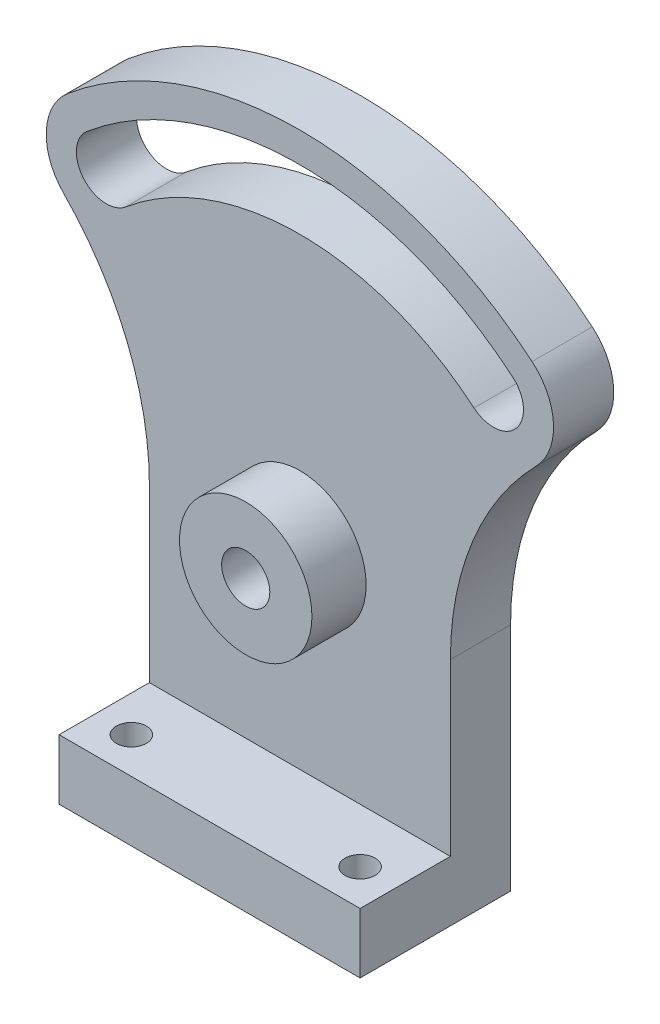
ISO-10303-21;
HEADER;
FILE_DESCRIPTION(('STEP AP214'),'2;1');
FILE_NAME('part.step','',(''),(''),'','','');
FILE_SCHEMA(('AUTOMOTIVE_DESIGN { 1 0 10303 214 1 1 1 1 }'));
ENDSEC;
DATA;
#1=APPLICATION_CONTEXT('core data for automotive mechanical design processes');
#2=APPLICATION_PROTOCOL_DEFINITION('international standard','automotive_design',2000,#1);
#3=PRODUCT_CONTEXT('',#1,'mechanical');
#4=PRODUCT('Part','Part','',(#3));
#5=PRODUCT_RELATED_PRODUCT_CATEGORY('part','',(#4));
#6=PRODUCT_DEFINITION_FORMATION('','',#4);
#7=PRODUCT_DEFINITION_CONTEXT('part definition',#1,'design');
#8=PRODUCT_DEFINITION('design','',#6,#7);
#9=PRODUCT_DEFINITION_SHAPE('','',#8);
#10=(LENGTH_UNIT() NAMED_UNIT(*) SI_UNIT(.MILLI.,.METRE.));
#11=(NAMED_UNIT(*) PLANE_ANGLE_UNIT() SI_UNIT($,.RADIAN.));
#12=(NAMED_UNIT(*) SI_UNIT($,.STERADIAN.) SOLID_ANGLE_UNIT());
#13=UNCERTAINTY_MEASURE_WITH_UNIT(LENGTH_MEASURE(1.E-05),#10,'distance_accuracy_value','');
#14=(GEOMETRIC_REPRESENTATION_CONTEXT(3) GLOBAL_UNCERTAINTY_ASSIGNED_CONTEXT((#13)) GLOBAL_UNIT_ASSIGNED_CONTEXT((#10,
#11,#12)) REPRESENTATION_CONTEXT('',''));
#15=CARTESIAN_POINT('',(0.,0.,0.));
#16=DIRECTION('',(0.,0.,1.));
#17=DIRECTION('',(1.,0.,0.));
#18=AXIS2_PLACEMENT_3D('',#15,#16,#17);
#19=CARTESIAN_POINT('',(25.,0.,25.));
#20=DIRECTION('',(1.,0.,0.));
#21=DIRECTION('',(0.,1.,0.));
#22=AXIS2_PLACEMENT_3D('',#19,#20,#21);
#23=PLANE('',#22);
#24=DIRECTION('',(0.,-1.,0.));
#25=VECTOR('',#24,1.);
#26=CARTESIAN_POINT('',(25.,0.,0.));
#27=LINE('',#26,#25);
#28=CARTESIAN_POINT('',(25.,38.3145180661476,0.));
#29=VERTEX_POINT('',#28);
#30=CARTESIAN_POINT('',(25.,0.,0.));
#31=VERTEX_POINT('',#30);
#32=EDGE_CURVE('E232',#29,#31,#27,.T.);
#33=ORIENTED_EDGE('',*,*,#32,.F.);
#34=DIRECTION('',(0.,0.,-1.));
#35=VECTOR('',#34,1.);
#36=CARTESIAN_POINT('',(25.,38.3145180661476,10.));
#37=LINE('',#36,#35);
#38=CARTESIAN_POINT('',(25.,38.3145180661476,10.));
#39=VERTEX_POINT('',#38);
#40=EDGE_CURVE('E259',#39,#29,#37,.T.);
#41=ORIENTED_EDGE('',*,*,#40,.F.);
#42=DIRECTION('',(0.,-1.,0.));
#43=VECTOR('',#42,1.);
#44=CARTESIAN_POINT('',(25.,0.,10.));
#45=LINE('',#44,#43);
#46=CARTESIAN_POINT('',(25.,10.,10.));
#47=VERTEX_POINT('',#46);
#48=EDGE_CURVE('E199',#39,#47,#45,.T.);
#49=ORIENTED_EDGE('',*,*,#48,.T.);
#50=DIRECTION('',(0.,0.,-1.));
#51=VECTOR('',#50,1.);
#52=CARTESIAN_POINT('',(25.,10.,25.));
#53=LINE('',#52,#51);
#54=CARTESIAN_POINT('',(25.,10.,25.));
#55=VERTEX_POINT('',#54);
#56=EDGE_CURVE('E82',#55,#47,#53,.T.);
#57=ORIENTED_EDGE('',*,*,#56,.F.);
#58=DIRECTION('',(0.,-1.,0.));
#59=VECTOR('',#58,1.);
#60=CARTESIAN_POINT('',(25.,0.,25.));
#61=LINE('',#60,#59);
#62=CARTESIAN_POINT('',(25.,0.,25.));
#63=VERTEX_POINT('',#62);
#64=EDGE_CURVE('E219',#55,#63,#61,.T.);
#65=ORIENTED_EDGE('',*,*,#64,.T.);
#66=DIRECTION('',(0.,0.,-1.));
#67=VECTOR('',#66,1.);
#68=CARTESIAN_POINT('',(25.,0.,25.));
#69=LINE('',#68,#67);
#70=EDGE_CURVE('E113',#63,#31,#69,.T.);
#71=ORIENTED_EDGE('',*,*,#70,.T.);
#72=EDGE_LOOP('',(#33,#41,#49,#57,#65,#71));
#73=FACE_BOUND('',#72,.T.);
#74=ADVANCED_FACE('F74',(#73),#23,.T.);
#75=CARTESIAN_POINT('',(0.,10.,25.));
#76=DIRECTION('',(0.,1.,0.));
#77=DIRECTION('',(-1.,0.,0.));
#78=AXIS2_PLACEMENT_3D('',#75,#76,#77);
#79=PLANE('',#78);
#80=CARTESIAN_POINT('',(-19.,10.,19.));
#81=DIRECTION('',(0.,1.,0.));
#82=DIRECTION('',(0.,0.,1.));
#83=AXIS2_PLACEMENT_3D('',#80,#81,#82);
#84=CIRCLE('',#83,2.49999999999999);
#85=CARTESIAN_POINT('',(-19.,10.,21.5));
#86=VERTEX_POINT('',#85);
#87=EDGE_CURVE('E377',#86,#86,#84,.T.);
#88=ORIENTED_EDGE('',*,*,#87,.F.);
#89=EDGE_LOOP('',(#88));
#90=FACE_BOUND('',#89,.T.);
#91=CARTESIAN_POINT('',(19.,10.,19.));
#92=DIRECTION('',(0.,1.,0.));
#93=DIRECTION('',(0.,0.,1.));
#94=AXIS2_PLACEMENT_3D('',#91,#92,#93);
#95=CIRCLE('',#94,2.49999999999999);
#96=CARTESIAN_POINT('',(19.,10.,21.5));
#97=VERTEX_POINT('',#96);
#98=EDGE_CURVE('E369',#97,#97,#95,.T.);
#99=ORIENTED_EDGE('',*,*,#98,.F.);
#100=EDGE_LOOP('',(#99));
#101=FACE_BOUND('',#100,.T.);
#102=DIRECTION('',(1.,0.,0.));
#103=VECTOR('',#102,1.);
#104=CARTESIAN_POINT('',(0.,10.,10.));
#105=LINE('',#104,#103);
#106=CARTESIAN_POINT('',(-25.,10.,10.));
#107=VERTEX_POINT('',#106);
#108=EDGE_CURVE('E89',#107,#47,#105,.T.);
#109=ORIENTED_EDGE('',*,*,#108,.F.);
#110=DIRECTION('',(0.,0.,-1.));
#111=VECTOR('',#110,1.);
#112=CARTESIAN_POINT('',(-25.,10.,25.));
#113=LINE('',#112,#111);
#114=CARTESIAN_POINT('',(-25.,10.,25.));
#115=VERTEX_POINT('',#114);
#116=EDGE_CURVE('E248',#115,#107,#113,.T.);
#117=ORIENTED_EDGE('',*,*,#116,.F.);
#118=DIRECTION('',(1.,0.,0.));
#119=VECTOR('',#118,1.);
#120=CARTESIAN_POINT('',(0.,10.,25.));
#121=LINE('',#120,#119);
#122=EDGE_CURVE('E222',#115,#55,#121,.T.);
#123=ORIENTED_EDGE('',*,*,#122,.T.);
#124=ORIENTED_EDGE('',*,*,#56,.T.);
#125=EDGE_LOOP('',(#109,#117,#123,#124));
#126=FACE_BOUND('',#125,.T.);
#127=ADVANCED_FACE('F251',(#90,#101,#126),#79,.T.);
#128=CARTESIAN_POINT('',(-25.,0.,25.));
#129=DIRECTION('',(1.,0.,0.));
#130=DIRECTION('',(0.,0.,-1.));
#131=AXIS2_PLACEMENT_3D('',#128,#129,#130);
#132=PLANE('',#131);
#133=DIRECTION('',(0.,-1.,0.));
#134=VECTOR('',#133,1.);
#135=CARTESIAN_POINT('',(-25.,0.,0.));
#136=LINE('',#135,#134);
#137=CARTESIAN_POINT('',(-25.,38.3145180661475,0.));
#138=VERTEX_POINT('',#137);
#139=CARTESIAN_POINT('',(-25.,0.,0.));
#140=VERTEX_POINT('',#139);
#141=EDGE_CURVE('E236',#138,#140,#136,.T.);
#142=ORIENTED_EDGE('',*,*,#141,.T.);
#143=DIRECTION('',(0.,0.,-1.));
#144=VECTOR('',#143,1.);
#145=CARTESIAN_POINT('',(-25.,0.,25.));
#146=LINE('',#145,#144);
#147=CARTESIAN_POINT('',(-25.,0.,25.));
#148=VERTEX_POINT('',#147);
#149=EDGE_CURVE('E244',#148,#140,#146,.T.);
#150=ORIENTED_EDGE('',*,*,#149,.F.);
#151=DIRECTION('',(0.,-1.,0.));
#152=VECTOR('',#151,1.);
#153=CARTESIAN_POINT('',(-25.,0.,25.));
#154=LINE('',#153,#152);
#155=EDGE_CURVE('E227',#115,#148,#154,.T.);
#156=ORIENTED_EDGE('',*,*,#155,.F.);
#157=ORIENTED_EDGE('',*,*,#116,.T.);
#158=DIRECTION('',(0.,-1.,0.));
#159=VECTOR('',#158,1.);
#160=CARTESIAN_POINT('',(-25.,0.,10.));
#161=LINE('',#160,#159);
#162=CARTESIAN_POINT('',(-25.,38.3145180661475,10.));
#163=VERTEX_POINT('',#162);
#164=EDGE_CURVE('E256',#163,#107,#161,.T.);
#165=ORIENTED_EDGE('',*,*,#164,.F.);
#166=DIRECTION('',(0.,0.,-1.));
#167=VECTOR('',#166,1.);
#168=CARTESIAN_POINT('',(-25.,38.3145180661475,10.));
#169=LINE('',#168,#167);
#170=EDGE_CURVE('E324',#163,#138,#169,.T.);
#171=ORIENTED_EDGE('',*,*,#170,.T.);
#172=EDGE_LOOP('',(#142,#150,#156,#157,#165,#171));
#173=FACE_BOUND('',#172,.T.);
#174=ADVANCED_FACE('F386',(#173),#132,.F.);
#175=CARTESIAN_POINT('',(0.,0.,25.));
#176=DIRECTION('',(0.,1.,0.));
#177=DIRECTION('',(-1.,0.,0.));
#178=AXIS2_PLACEMENT_3D('',#175,#176,#177);
#179=PLANE('',#178);
#180=CARTESIAN_POINT('',(-19.,0.,19.));
#181=DIRECTION('',(0.,1.,0.));
#182=DIRECTION('',(-1.,0.,0.));
#183=AXIS2_PLACEMENT_3D('',#180,#181,#182);
#184=CIRCLE('',#183,2.49999999999999);
#185=CARTESIAN_POINT('',(-21.5,0.,19.));
#186=VERTEX_POINT('',#185);
#187=EDGE_CURVE('E373',#186,#186,#184,.T.);
#188=ORIENTED_EDGE('',*,*,#187,.T.);
#189=EDGE_LOOP('',(#188));
#190=FACE_BOUND('',#189,.T.);
#191=CARTESIAN_POINT('',(19.,0.,19.));
#192=DIRECTION('',(0.,1.,0.));
#193=DIRECTION('',(-1.,0.,0.));
#194=AXIS2_PLACEMENT_3D('',#191,#192,#193);
#195=CIRCLE('',#194,2.49999999999999);
#196=CARTESIAN_POINT('',(16.5,0.,19.));
#197=VERTEX_POINT('',#196);
#198=EDGE_CURVE('E365',#197,#197,#195,.T.);
#199=ORIENTED_EDGE('',*,*,#198,.T.);
#200=EDGE_LOOP('',(#199));
#201=FACE_BOUND('',#200,.T.);
#202=DIRECTION('',(1.,0.,0.));
#203=VECTOR('',#202,1.);
#204=CARTESIAN_POINT('',(0.,0.,0.));
#205=LINE('',#204,#203);
#206=EDGE_CURVE('E223',#140,#31,#205,.T.);
#207=ORIENTED_EDGE('',*,*,#206,.T.);
#208=ORIENTED_EDGE('',*,*,#70,.F.);
#209=DIRECTION('',(1.,0.,0.));
#210=VECTOR('',#209,1.);
#211=CARTESIAN_POINT('',(0.,0.,25.));
#212=LINE('',#211,#210);
#213=EDGE_CURVE('E98',#148,#63,#212,.T.);
#214=ORIENTED_EDGE('',*,*,#213,.F.);
#215=ORIENTED_EDGE('',*,*,#149,.T.);
#216=EDGE_LOOP('',(#207,#208,#214,#215));
#217=FACE_BOUND('',#216,.T.);
#218=ADVANCED_FACE('F420',(#190,#201,#217),#179,.F.);
#219=CARTESIAN_POINT('',(0.,0.,25.));
#220=DIRECTION('',(0.,0.,1.));
#221=DIRECTION('',(1.,0.,0.));
#222=AXIS2_PLACEMENT_3D('',#219,#220,#221);
#223=PLANE('',#222);
#224=ORIENTED_EDGE('',*,*,#64,.F.);
#225=ORIENTED_EDGE('',*,*,#122,.F.);
#226=ORIENTED_EDGE('',*,*,#155,.T.);
#227=ORIENTED_EDGE('',*,*,#213,.T.);
#228=EDGE_LOOP('',(#224,#225,#226,#227));
#229=FACE_BOUND('',#228,.T.);
#230=ADVANCED_FACE('F415',(#229),#223,.T.);
#231=CARTESIAN_POINT('',(0.,0.,0.));
#232=DIRECTION('',(0.,0.,1.));
#233=DIRECTION('',(1.,0.,0.));
#234=AXIS2_PLACEMENT_3D('',#231,#232,#233);
#235=PLANE('',#234);
#236=ORIENTED_EDGE('',*,*,#32,.T.);
#237=ORIENTED_EDGE('',*,*,#206,.F.);
#238=ORIENTED_EDGE('',*,*,#141,.F.);
#239=CARTESIAN_POINT('',(-75.,38.3145180661475,0.));
#240=DIRECTION('',(0.,0.,1.));
#241=DIRECTION('',(1.,0.,0.));
#242=AXIS2_PLACEMENT_3D('',#239,#240,#241);
#243=CIRCLE('',#242,50.);
#244=CARTESIAN_POINT('',(-39.2828170702725,73.3042714743153,0.));
#245=VERTEX_POINT('',#244);
#246=EDGE_CURVE('E296',#138,#245,#243,.T.);
#247=ORIENTED_EDGE('',*,*,#246,.T.);
#248=CARTESIAN_POINT('',(-32.139380484327,80.3022221559488,0.));
#249=DIRECTION('',(0.,0.,1.));
#250=DIRECTION('',(1.,0.,0.));
#251=AXIS2_PLACEMENT_3D('',#248,#249,#250);
#252=CIRCLE('',#251,10.);
#253=CARTESIAN_POINT('',(-38.5672565811925,87.9626665871386,0.));
#254=VERTEX_POINT('',#253);
#255=EDGE_CURVE('E292',#254,#245,#252,.T.);
#256=ORIENTED_EDGE('',*,*,#255,.F.);
#257=CARTESIAN_POINT('',(0.,42.,0.));
#258=DIRECTION('',(0.,0.,1.));
#259=DIRECTION('',(1.,0.,0.));
#260=AXIS2_PLACEMENT_3D('',#257,#258,#259);
#261=CIRCLE('',#260,60.);
#262=CARTESIAN_POINT('',(38.5672565811924,87.9626665871386,0.));
#263=VERTEX_POINT('',#262);
#264=EDGE_CURVE('E289',#263,#254,#261,.T.);
#265=ORIENTED_EDGE('',*,*,#264,.F.);
#266=CARTESIAN_POINT('',(32.139380484327,80.3022221559489,0.));
#267=DIRECTION('',(0.,0.,1.));
#268=DIRECTION('',(1.,0.,0.));
#269=AXIS2_PLACEMENT_3D('',#266,#267,#268);
#270=CIRCLE('',#269,10.);
#271=CARTESIAN_POINT('',(39.2828170702725,73.3042714743153,0.));
#272=VERTEX_POINT('',#271);
#273=EDGE_CURVE('E285',#272,#263,#270,.T.);
#274=ORIENTED_EDGE('',*,*,#273,.F.);
#275=CARTESIAN_POINT('',(75.,38.3145180661476,0.));
#276=DIRECTION('',(0.,0.,1.));
#277=DIRECTION('',(1.,0.,0.));
#278=AXIS2_PLACEMENT_3D('',#275,#276,#277);
#279=CIRCLE('',#278,50.);
#280=EDGE_CURVE('E207',#29,#272,#279,.F.);
#281=ORIENTED_EDGE('',*,*,#280,.F.);
#282=EDGE_LOOP('',(#236,#237,#238,#247,#256,#265,#274,#281));
#283=FACE_BOUND('',#282,.T.);
#284=CARTESIAN_POINT('',(-32.139380484327,80.3022221559488,0.));
#285=DIRECTION('',(0.,0.,1.));
#286=DIRECTION('',(1.,0.,0.));
#287=AXIS2_PLACEMENT_3D('',#284,#285,#286);
#288=CIRCLE('',#287,4.99999999999998);
#289=CARTESIAN_POINT('',(-35.3533185327597,84.1324443715437,0.));
#290=VERTEX_POINT('',#289);
#291=CARTESIAN_POINT('',(-28.9254424358943,76.471999940354,0.));
#292=VERTEX_POINT('',#291);
#293=EDGE_CURVE('E300',#290,#292,#288,.T.);
#294=ORIENTED_EDGE('',*,*,#293,.T.);
#295=CARTESIAN_POINT('',(0.,42.,0.));
#296=DIRECTION('',(0.,0.,1.));
#297=DIRECTION('',(1.,0.,0.));
#298=AXIS2_PLACEMENT_3D('',#295,#296,#297);
#299=CIRCLE('',#298,45.);
#300=CARTESIAN_POINT('',(28.9254424358943,76.471999940354,0.));
#301=VERTEX_POINT('',#300);
#302=EDGE_CURVE('E203',#301,#292,#299,.T.);
#303=ORIENTED_EDGE('',*,*,#302,.F.);
#304=CARTESIAN_POINT('',(32.139380484327,80.3022221559489,0.));
#305=DIRECTION('',(0.,0.,1.));
#306=DIRECTION('',(1.,0.,0.));
#307=AXIS2_PLACEMENT_3D('',#304,#305,#306);
#308=CIRCLE('',#307,4.99999999999998);
#309=CARTESIAN_POINT('',(35.3533185327597,84.1324443715437,0.));
#310=VERTEX_POINT('',#309);
#311=EDGE_CURVE('E308',#301,#310,#308,.T.);
#312=ORIENTED_EDGE('',*,*,#311,.T.);
#313=CARTESIAN_POINT('',(0.,42.,0.));
#314=DIRECTION('',(0.,0.,1.));
#315=DIRECTION('',(1.,0.,0.));
#316=AXIS2_PLACEMENT_3D('',#313,#314,#315);
#317=CIRCLE('',#316,55.);
#318=EDGE_CURVE('E304',#310,#290,#317,.T.);
#319=ORIENTED_EDGE('',*,*,#318,.T.);
#320=EDGE_LOOP('',(#294,#303,#312,#319));
#321=FACE_BOUND('',#320,.T.);
#322=ADVANCED_FACE('F342',(#283,#321),#235,.F.);
#323=CARTESIAN_POINT('',(-32.139380484327,80.3022221559488,10.));
#324=DIRECTION('',(0.,0.,-1.));
#325=DIRECTION('',(-1.,0.,0.));
#326=AXIS2_PLACEMENT_3D('',#323,#324,#325);
#327=CYLINDRICAL_SURFACE('',#326,4.99999999999998);
#328=ORIENTED_EDGE('',*,*,#293,.F.);
#329=DIRECTION('',(0.,0.,-1.));
#330=VECTOR('',#329,1.);
#331=CARTESIAN_POINT('',(-35.3533185327597,84.1324443715437,10.));
#332=LINE('',#331,#330);
#333=CARTESIAN_POINT('',(-35.3533185327597,84.1324443715437,10.));
#334=VERTEX_POINT('',#333);
#335=EDGE_CURVE('E237',#334,#290,#332,.T.);
#336=ORIENTED_EDGE('',*,*,#335,.F.);
#337=CARTESIAN_POINT('',(-32.139380484327,80.3022221559488,10.));
#338=DIRECTION('',(0.,0.,1.));
#339=DIRECTION('',(1.,0.,0.));
#340=AXIS2_PLACEMENT_3D('',#337,#338,#339);
#341=CIRCLE('',#340,4.99999999999998);
#342=CARTESIAN_POINT('',(-28.9254424358943,76.471999940354,10.));
#343=VERTEX_POINT('',#342);
#344=EDGE_CURVE('E265',#334,#343,#341,.T.);
#345=ORIENTED_EDGE('',*,*,#344,.T.);
#346=DIRECTION('',(0.,0.,-1.));
#347=VECTOR('',#346,1.);
#348=CARTESIAN_POINT('',(-28.9254424358943,76.471999940354,10.));
#349=LINE('',#348,#347);
#350=EDGE_CURVE('E209',#343,#292,#349,.T.);
#351=ORIENTED_EDGE('',*,*,#350,.T.);
#352=EDGE_LOOP('',(#328,#336,#345,#351));
#353=FACE_BOUND('',#352,.T.);
#354=ADVANCED_FACE('F427',(#353),#327,.F.);
#355=CARTESIAN_POINT('',(0.,42.,10.));
#356=DIRECTION('',(0.,0.,-1.));
#357=DIRECTION('',(-1.,0.,0.));
#358=AXIS2_PLACEMENT_3D('',#355,#356,#357);
#359=CYLINDRICAL_SURFACE('',#358,55.);
#360=ORIENTED_EDGE('',*,*,#318,.F.);
#361=DIRECTION('',(0.,0.,-1.));
#362=VECTOR('',#361,1.);
#363=CARTESIAN_POINT('',(35.3533185327597,84.1324443715437,10.));
#364=LINE('',#363,#362);
#365=CARTESIAN_POINT('',(35.3533185327597,84.1324443715437,10.));
#366=VERTEX_POINT('',#365);
#367=EDGE_CURVE('E317',#366,#310,#364,.T.);
#368=ORIENTED_EDGE('',*,*,#367,.F.);
#369=CARTESIAN_POINT('',(0.,42.,10.));
#370=DIRECTION('',(0.,0.,1.));
#371=DIRECTION('',(1.,0.,0.));
#372=AXIS2_PLACEMENT_3D('',#369,#370,#371);
#373=CIRCLE('',#372,55.);
#374=EDGE_CURVE('E272',#366,#334,#373,.T.);
#375=ORIENTED_EDGE('',*,*,#374,.T.);
#376=ORIENTED_EDGE('',*,*,#335,.T.);
#377=EDGE_LOOP('',(#360,#368,#375,#376));
#378=FACE_BOUND('',#377,.T.);
#379=ADVANCED_FACE('F431',(#378),#359,.F.);
#380=CARTESIAN_POINT('',(32.139380484327,80.3022221559489,10.));
#381=DIRECTION('',(0.,0.,-1.));
#382=DIRECTION('',(-1.,0.,0.));
#383=AXIS2_PLACEMENT_3D('',#380,#381,#382);
#384=CYLINDRICAL_SURFACE('',#383,4.99999999999998);
#385=ORIENTED_EDGE('',*,*,#311,.F.);
#386=DIRECTION('',(0.,0.,-1.));
#387=VECTOR('',#386,1.);
#388=CARTESIAN_POINT('',(28.9254424358943,76.471999940354,10.));
#389=LINE('',#388,#387);
#390=CARTESIAN_POINT('',(28.9254424358943,76.471999940354,10.));
#391=VERTEX_POINT('',#390);
#392=EDGE_CURVE('E213',#391,#301,#389,.T.);
#393=ORIENTED_EDGE('',*,*,#392,.F.);
#394=CARTESIAN_POINT('',(32.139380484327,80.3022221559489,10.));
#395=DIRECTION('',(0.,0.,1.));
#396=DIRECTION('',(1.,0.,0.));
#397=AXIS2_PLACEMENT_3D('',#394,#395,#396);
#398=CIRCLE('',#397,4.99999999999998);
#399=EDGE_CURVE('E276',#391,#366,#398,.T.);
#400=ORIENTED_EDGE('',*,*,#399,.T.);
#401=ORIENTED_EDGE('',*,*,#367,.T.);
#402=EDGE_LOOP('',(#385,#393,#400,#401));
#403=FACE_BOUND('',#402,.T.);
#404=ADVANCED_FACE('F441',(#403),#384,.F.);
#405=CARTESIAN_POINT('',(75.,38.3145180661476,10.));
#406=DIRECTION('',(0.,0.,-1.));
#407=DIRECTION('',(-1.,0.,0.));
#408=AXIS2_PLACEMENT_3D('',#405,#406,#407);
#409=CYLINDRICAL_SURFACE('',#408,50.);
#410=ORIENTED_EDGE('',*,*,#280,.T.);
#411=DIRECTION('',(0.,0.,-1.));
#412=VECTOR('',#411,1.);
#413=CARTESIAN_POINT('',(39.2828170702725,73.3042714743153,10.));
#414=LINE('',#413,#412);
#415=CARTESIAN_POINT('',(39.2828170702725,73.3042714743153,10.));
#416=VERTEX_POINT('',#415);
#417=EDGE_CURVE('E185',#416,#272,#414,.T.);
#418=ORIENTED_EDGE('',*,*,#417,.F.);
#419=CARTESIAN_POINT('',(75.,38.3145180661476,10.));
#420=DIRECTION('',(0.,0.,1.));
#421=DIRECTION('',(1.,0.,0.));
#422=AXIS2_PLACEMENT_3D('',#419,#420,#421);
#423=CIRCLE('',#422,50.);
#424=EDGE_CURVE('E193',#39,#416,#423,.F.);
#425=ORIENTED_EDGE('',*,*,#424,.F.);
#426=ORIENTED_EDGE('',*,*,#40,.T.);
#427=EDGE_LOOP('',(#410,#418,#425,#426));
#428=FACE_BOUND('',#427,.T.);
#429=ADVANCED_FACE('F205',(#428),#409,.F.);
#430=CARTESIAN_POINT('',(32.139380484327,80.3022221559489,10.));
#431=DIRECTION('',(0.,0.,-1.));
#432=DIRECTION('',(-1.,0.,0.));
#433=AXIS2_PLACEMENT_3D('',#430,#431,#432);
#434=CYLINDRICAL_SURFACE('',#433,10.);
#435=ORIENTED_EDGE('',*,*,#273,.T.);
#436=DIRECTION('',(0.,0.,-1.));
#437=VECTOR('',#436,1.);
#438=CARTESIAN_POINT('',(38.5672565811924,87.9626665871386,10.));
#439=LINE('',#438,#437);
#440=CARTESIAN_POINT('',(38.5672565811924,87.9626665871386,10.));
#441=VERTEX_POINT('',#440);
#442=EDGE_CURVE('E188',#441,#263,#439,.T.);
#443=ORIENTED_EDGE('',*,*,#442,.F.);
#444=CARTESIAN_POINT('',(32.139380484327,80.3022221559489,10.));
#445=DIRECTION('',(0.,0.,1.));
#446=DIRECTION('',(1.,0.,0.));
#447=AXIS2_PLACEMENT_3D('',#444,#445,#446);
#448=CIRCLE('',#447,10.);
#449=EDGE_CURVE('E181',#416,#441,#448,.T.);
#450=ORIENTED_EDGE('',*,*,#449,.F.);
#451=ORIENTED_EDGE('',*,*,#417,.T.);
#452=EDGE_LOOP('',(#435,#443,#450,#451));
#453=FACE_BOUND('',#452,.T.);
#454=ADVANCED_FACE('F183',(#453),#434,.T.);
#455=CARTESIAN_POINT('',(0.,42.,10.));
#456=DIRECTION('',(0.,0.,-1.));
#457=DIRECTION('',(-1.,0.,0.));
#458=AXIS2_PLACEMENT_3D('',#455,#456,#457);
#459=CYLINDRICAL_SURFACE('',#458,60.);
#460=ORIENTED_EDGE('',*,*,#264,.T.);
#461=DIRECTION('',(0.,0.,-1.));
#462=VECTOR('',#461,1.);
#463=CARTESIAN_POINT('',(-38.5672565811925,87.9626665871386,10.));
#464=LINE('',#463,#462);
#465=CARTESIAN_POINT('',(-38.5672565811925,87.9626665871386,10.));
#466=VERTEX_POINT('',#465);
#467=EDGE_CURVE('E215',#466,#254,#464,.T.);
#468=ORIENTED_EDGE('',*,*,#467,.F.);
#469=CARTESIAN_POINT('',(0.,42.,10.));
#470=DIRECTION('',(0.,0.,1.));
#471=DIRECTION('',(1.,0.,0.));
#472=AXIS2_PLACEMENT_3D('',#469,#470,#471);
#473=CIRCLE('',#472,60.);
#474=EDGE_CURVE('E192',#441,#466,#473,.T.);
#475=ORIENTED_EDGE('',*,*,#474,.F.);
#476=ORIENTED_EDGE('',*,*,#442,.T.);
#477=EDGE_LOOP('',(#460,#468,#475,#476));
#478=FACE_BOUND('',#477,.T.);
#479=ADVANCED_FACE('F465',(#478),#459,.T.);
#480=CARTESIAN_POINT('',(-32.139380484327,80.3022221559488,10.));
#481=DIRECTION('',(0.,0.,-1.));
#482=DIRECTION('',(-1.,0.,0.));
#483=AXIS2_PLACEMENT_3D('',#480,#481,#482);
#484=CYLINDRICAL_SURFACE('',#483,10.);
#485=ORIENTED_EDGE('',*,*,#255,.T.);
#486=DIRECTION('',(0.,0.,-1.));
#487=VECTOR('',#486,1.);
#488=CARTESIAN_POINT('',(-39.2828170702725,73.3042714743153,10.));
#489=LINE('',#488,#487);
#490=CARTESIAN_POINT('',(-39.2828170702725,73.3042714743153,10.));
#491=VERTEX_POINT('',#490);
#492=EDGE_CURVE('E328',#491,#245,#489,.T.);
#493=ORIENTED_EDGE('',*,*,#492,.F.);
#494=CARTESIAN_POINT('',(-32.139380484327,80.3022221559488,10.));
#495=DIRECTION('',(0.,0.,1.));
#496=DIRECTION('',(1.,0.,0.));
#497=AXIS2_PLACEMENT_3D('',#494,#495,#496);
#498=CIRCLE('',#497,10.);
#499=EDGE_CURVE('E338',#466,#491,#498,.T.);
#500=ORIENTED_EDGE('',*,*,#499,.F.);
#501=ORIENTED_EDGE('',*,*,#467,.T.);
#502=EDGE_LOOP('',(#485,#493,#500,#501));
#503=FACE_BOUND('',#502,.T.);
#504=ADVANCED_FACE('F336',(#503),#484,.T.);
#505=CARTESIAN_POINT('',(-75.,38.3145180661475,10.));
#506=DIRECTION('',(0.,0.,-1.));
#507=DIRECTION('',(-1.,0.,0.));
#508=AXIS2_PLACEMENT_3D('',#505,#506,#507);
#509=CYLINDRICAL_SURFACE('',#508,50.);
#510=ORIENTED_EDGE('',*,*,#246,.F.);
#511=ORIENTED_EDGE('',*,*,#170,.F.);
#512=CARTESIAN_POINT('',(-75.,38.3145180661475,10.));
#513=DIRECTION('',(0.,0.,1.));
#514=DIRECTION('',(1.,0.,0.));
#515=AXIS2_PLACEMENT_3D('',#512,#513,#514);
#516=CIRCLE('',#515,50.);
#517=EDGE_CURVE('E349',#163,#491,#516,.T.);
#518=ORIENTED_EDGE('',*,*,#517,.T.);
#519=ORIENTED_EDGE('',*,*,#492,.T.);
#520=EDGE_LOOP('',(#510,#511,#518,#519));
#521=FACE_BOUND('',#520,.T.);
#522=ADVANCED_FACE('F347',(#521),#509,.F.);
#523=CARTESIAN_POINT('',(0.,42.,10.));
#524=DIRECTION('',(0.,0.,-1.));
#525=DIRECTION('',(-1.,0.,0.));
#526=AXIS2_PLACEMENT_3D('',#523,#524,#525);
#527=CYLINDRICAL_SURFACE('',#526,45.);
#528=ORIENTED_EDGE('',*,*,#302,.T.);
#529=ORIENTED_EDGE('',*,*,#350,.F.);
#530=CARTESIAN_POINT('',(0.,42.,10.));
#531=DIRECTION('',(0.,0.,1.));
#532=DIRECTION('',(1.,0.,0.));
#533=AXIS2_PLACEMENT_3D('',#530,#531,#532);
#534=CIRCLE('',#533,45.);
#535=EDGE_CURVE('E280',#391,#343,#534,.T.);
#536=ORIENTED_EDGE('',*,*,#535,.F.);
#537=ORIENTED_EDGE('',*,*,#392,.T.);
#538=EDGE_LOOP('',(#528,#529,#536,#537));
#539=FACE_BOUND('',#538,.T.);
#540=ADVANCED_FACE('F487',(#539),#527,.T.);
#541=CARTESIAN_POINT('',(0.,0.,10.));
#542=DIRECTION('',(0.,0.,1.));
#543=DIRECTION('',(1.,0.,0.));
#544=AXIS2_PLACEMENT_3D('',#541,#542,#543);
#545=PLANE('',#544);
#546=ORIENTED_EDGE('',*,*,#424,.T.);
#547=ORIENTED_EDGE('',*,*,#449,.T.);
#548=ORIENTED_EDGE('',*,*,#474,.T.);
#549=ORIENTED_EDGE('',*,*,#499,.T.);
#550=ORIENTED_EDGE('',*,*,#517,.F.);
#551=ORIENTED_EDGE('',*,*,#164,.T.);
#552=ORIENTED_EDGE('',*,*,#108,.T.);
#553=ORIENTED_EDGE('',*,*,#48,.F.);
#554=EDGE_LOOP('',(#546,#547,#548,#549,#550,#551,#552,#553));
#555=FACE_BOUND('',#554,.T.);
#556=CARTESIAN_POINT('',(0.,42.,10.));
#557=DIRECTION('',(0.,0.,1.));
#558=DIRECTION('',(1.,0.,0.));
#559=AXIS2_PLACEMENT_3D('',#556,#557,#558);
#560=CIRCLE('',#559,11.);
#561=CARTESIAN_POINT('',(11.,42.,10.));
#562=VERTEX_POINT('',#561);
#563=EDGE_CURVE('E261',#562,#562,#560,.T.);
#564=ORIENTED_EDGE('',*,*,#563,.F.);
#565=EDGE_LOOP('',(#564));
#566=FACE_BOUND('',#565,.T.);
#567=ORIENTED_EDGE('',*,*,#344,.F.);
#568=ORIENTED_EDGE('',*,*,#374,.F.);
#569=ORIENTED_EDGE('',*,*,#399,.F.);
#570=ORIENTED_EDGE('',*,*,#535,.T.);
#571=EDGE_LOOP('',(#567,#568,#569,#570));
#572=FACE_BOUND('',#571,.T.);
#573=ADVANCED_FACE('F197',(#555,#566,#572),#545,.T.);
#574=CARTESIAN_POINT('',(0.,42.,19.));
#575=DIRECTION('',(0.,0.,-1.));
#576=DIRECTION('',(-1.,0.,0.));
#577=AXIS2_PLACEMENT_3D('',#574,#575,#576);
#578=CYLINDRICAL_SURFACE('',#577,4.);
#579=CARTESIAN_POINT('',(0.,42.,10.));
#580=DIRECTION('',(0.,0.,1.));
#581=DIRECTION('',(1.,0.,0.));
#582=AXIS2_PLACEMENT_3D('',#579,#580,#581);
#583=CIRCLE('',#582,4.);
#584=CARTESIAN_POINT('',(4.,42.,10.));
#585=VERTEX_POINT('',#584);
#586=EDGE_CURVE('E12',#585,#585,#583,.T.);
#587=ORIENTED_EDGE('',*,*,#586,.F.);
#588=EDGE_LOOP('',(#587));
#589=FACE_BOUND('',#588,.T.);
#590=CARTESIAN_POINT('',(0.,42.,19.));
#591=DIRECTION('',(0.,0.,1.));
#592=DIRECTION('',(1.,0.,0.));
#593=AXIS2_PLACEMENT_3D('',#590,#591,#592);
#594=CIRCLE('',#593,4.);
#595=CARTESIAN_POINT('',(4.,42.,19.));
#596=VERTEX_POINT('',#595);
#597=EDGE_CURVE('E361',#596,#596,#594,.T.);
#598=ORIENTED_EDGE('',*,*,#597,.T.);
#599=EDGE_LOOP('',(#598));
#600=FACE_BOUND('',#599,.T.);
#601=ADVANCED_FACE('F504',(#589,#600),#578,.F.);
#602=CARTESIAN_POINT('',(0.,42.,19.));
#603=DIRECTION('',(0.,0.,-1.));
#604=DIRECTION('',(-1.,0.,0.));
#605=AXIS2_PLACEMENT_3D('',#602,#603,#604);
#606=CYLINDRICAL_SURFACE('',#605,11.);
#607=ORIENTED_EDGE('',*,*,#563,.T.);
#608=EDGE_LOOP('',(#607));
#609=FACE_BOUND('',#608,.T.);
#610=CARTESIAN_POINT('',(0.,42.,19.));
#611=DIRECTION('',(0.,0.,1.));
#612=DIRECTION('',(1.,0.,0.));
#613=AXIS2_PLACEMENT_3D('',#610,#611,#612);
#614=CIRCLE('',#613,11.);
#615=CARTESIAN_POINT('',(11.,42.,19.));
#616=VERTEX_POINT('',#615);
#617=EDGE_CURVE('E286',#616,#616,#614,.T.);
#618=ORIENTED_EDGE('',*,*,#617,.F.);
#619=EDGE_LOOP('',(#618));
#620=FACE_BOUND('',#619,.T.);
#621=ADVANCED_FACE('F519',(#609,#620),#606,.T.);
#622=CARTESIAN_POINT('',(0.,0.,19.));
#623=DIRECTION('',(0.,0.,1.));
#624=DIRECTION('',(1.,0.,0.));
#625=AXIS2_PLACEMENT_3D('',#622,#623,#624);
#626=PLANE('',#625);
#627=ORIENTED_EDGE('',*,*,#597,.F.);
#628=EDGE_LOOP('',(#627));
#629=FACE_BOUND('',#628,.T.);
#630=ORIENTED_EDGE('',*,*,#617,.T.);
#631=EDGE_LOOP('',(#630));
#632=FACE_BOUND('',#631,.T.);
#633=ADVANCED_FACE('F401',(#629,#632),#626,.T.);
#634=CARTESIAN_POINT('',(0.,0.,10.));
#635=DIRECTION('',(0.,0.,1.));
#636=DIRECTION('',(1.,0.,0.));
#637=AXIS2_PLACEMENT_3D('',#634,#635,#636);
#638=PLANE('',#637);
#639=ORIENTED_EDGE('',*,*,#586,.T.);
#640=EDGE_LOOP('',(#639));
#641=FACE_BOUND('',#640,.T.);
#642=ADVANCED_FACE('F391',(#641),#638,.T.);
#643=CARTESIAN_POINT('',(19.,10.,19.));
#644=DIRECTION('',(0.,1.,0.));
#645=DIRECTION('',(0.,0.,1.));
#646=AXIS2_PLACEMENT_3D('',#643,#644,#645);
#647=CYLINDRICAL_SURFACE('',#646,2.49999999999999);
#648=ORIENTED_EDGE('',*,*,#198,.F.);
#649=EDGE_LOOP('',(#648));
#650=FACE_BOUND('',#649,.T.);
#651=ORIENTED_EDGE('',*,*,#98,.T.);
#652=EDGE_LOOP('',(#651));
#653=FACE_BOUND('',#652,.T.);
#654=ADVANCED_FACE('F389',(#650,#653),#647,.F.);
#655=CARTESIAN_POINT('',(-19.,10.,19.));
#656=DIRECTION('',(0.,1.,0.));
#657=DIRECTION('',(0.,0.,1.));
#658=AXIS2_PLACEMENT_3D('',#655,#656,#657);
#659=CYLINDRICAL_SURFACE('',#658,2.49999999999999);
#660=ORIENTED_EDGE('',*,*,#187,.F.);
#661=EDGE_LOOP('',(#660));
#662=FACE_BOUND('',#661,.T.);
#663=ORIENTED_EDGE('',*,*,#87,.T.);
#664=EDGE_LOOP('',(#663));
#665=FACE_BOUND('',#664,.T.);
#666=ADVANCED_FACE('F382',(#662,#665),#659,.F.);
#667=CLOSED_SHELL('',(#74,#127,#174,#218,#230,#322,#354,#379,#404,#429,#454,#479,#504,#522,#540,
#573,#601,#621,#633,#642,#654,#666));
#668=MANIFOLD_SOLID_BREP('B2',#667);
#669=ADVANCED_BREP_SHAPE_REPRESENTATION('',(#18,#668),#14);
#670=SHAPE_DEFINITION_REPRESENTATION(#9,#669);
ENDSEC;
END-ISO-10303-21;
